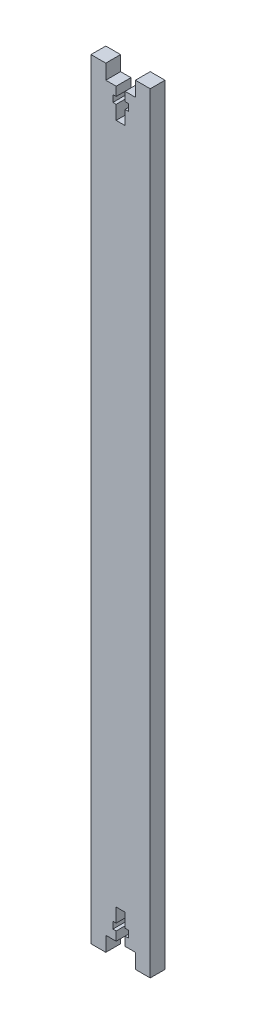
ISO-10303-21;
HEADER;
FILE_DESCRIPTION(('STEP AP214'),'2;1');
FILE_NAME('part.step','',(''),(''),'','','');
FILE_SCHEMA(('AUTOMOTIVE_DESIGN { 1 0 10303 214 1 1 1 1 }'));
ENDSEC;
DATA;
#1=APPLICATION_CONTEXT('core data for automotive mechanical design processes');
#2=APPLICATION_PROTOCOL_DEFINITION('international standard','automotive_design',2000,#1);
#3=PRODUCT_CONTEXT('',#1,'mechanical');
#4=PRODUCT('Part','Part','',(#3));
#5=PRODUCT_RELATED_PRODUCT_CATEGORY('part','',(#4));
#6=PRODUCT_DEFINITION_FORMATION('','',#4);
#7=PRODUCT_DEFINITION_CONTEXT('part definition',#1,'design');
#8=PRODUCT_DEFINITION('design','',#6,#7);
#9=PRODUCT_DEFINITION_SHAPE('','',#8);
#10=(LENGTH_UNIT() NAMED_UNIT(*) SI_UNIT(.MILLI.,.METRE.));
#11=(NAMED_UNIT(*) PLANE_ANGLE_UNIT() SI_UNIT($,.RADIAN.));
#12=(NAMED_UNIT(*) SI_UNIT($,.STERADIAN.) SOLID_ANGLE_UNIT());
#13=UNCERTAINTY_MEASURE_WITH_UNIT(LENGTH_MEASURE(1.E-05),#10,'distance_accuracy_value','');
#14=(GEOMETRIC_REPRESENTATION_CONTEXT(3) GLOBAL_UNCERTAINTY_ASSIGNED_CONTEXT((#13)) GLOBAL_UNIT_ASSIGNED_CONTEXT((#10,
#11,#12)) REPRESENTATION_CONTEXT('',''));
#15=CARTESIAN_POINT('',(0.,0.,0.));
#16=DIRECTION('',(0.,0.,1.));
#17=DIRECTION('',(1.,0.,0.));
#18=AXIS2_PLACEMENT_3D('',#15,#16,#17);
#19=CARTESIAN_POINT('',(-15.1018676210207,4.00000000000001,5.));
#20=DIRECTION('',(0.,1.,0.));
#21=DIRECTION('',(0.,0.,1.));
#22=AXIS2_PLACEMENT_3D('',#19,#20,#21);
#23=PLANE('',#22);
#24=DIRECTION('',(1.,0.,0.));
#25=VECTOR('',#24,1.);
#26=CARTESIAN_POINT('',(-15.1018676210207,4.00000000000001,0.));
#27=LINE('',#26,#25);
#28=CARTESIAN_POINT('',(-20.1018676210207,4.00000000000001,0.));
#29=VERTEX_POINT('',#28);
#30=CARTESIAN_POINT('',(-15.1018676210207,4.00000000000001,0.));
#31=VERTEX_POINT('',#30);
#32=EDGE_CURVE('E296',#29,#31,#27,.T.);
#33=ORIENTED_EDGE('',*,*,#32,.T.);
#34=DIRECTION('',(0.,0.,-1.));
#35=VECTOR('',#34,1.);
#36=CARTESIAN_POINT('',(-15.1018676210207,4.00000000000001,5.));
#37=LINE('',#36,#35);
#38=CARTESIAN_POINT('',(-15.1018676210207,4.00000000000001,5.));
#39=VERTEX_POINT('',#38);
#40=EDGE_CURVE('E40',#39,#31,#37,.T.);
#41=ORIENTED_EDGE('',*,*,#40,.F.);
#42=DIRECTION('',(1.,0.,0.));
#43=VECTOR('',#42,1.);
#44=CARTESIAN_POINT('',(-15.1018676210207,4.00000000000001,5.));
#45=LINE('',#44,#43);
#46=CARTESIAN_POINT('',(-20.1018676210207,4.00000000000001,5.));
#47=VERTEX_POINT('',#46);
#48=EDGE_CURVE('E554',#47,#39,#45,.T.);
#49=ORIENTED_EDGE('',*,*,#48,.F.);
#50=DIRECTION('',(0.,0.,-1.));
#51=VECTOR('',#50,1.);
#52=CARTESIAN_POINT('',(-20.1018676210207,4.00000000000001,5.));
#53=LINE('',#52,#51);
#54=EDGE_CURVE('E11',#47,#29,#53,.T.);
#55=ORIENTED_EDGE('',*,*,#54,.T.);
#56=EDGE_LOOP('',(#33,#41,#49,#55));
#57=FACE_BOUND('',#56,.T.);
#58=ADVANCED_FACE('F32',(#57),#23,.F.);
#59=CARTESIAN_POINT('',(-15.1018676210207,4.00000000000001,5.));
#60=DIRECTION('',(-1.,0.,0.));
#61=DIRECTION('',(0.,0.,1.));
#62=AXIS2_PLACEMENT_3D('',#59,#60,#61);
#63=PLANE('',#62);
#64=DIRECTION('',(0.,1.,0.));
#65=VECTOR('',#64,1.);
#66=CARTESIAN_POINT('',(-15.1018676210207,4.00000000000001,0.));
#67=LINE('',#66,#65);
#68=CARTESIAN_POINT('',(-15.1018676210207,9.00000000000001,0.));
#69=VERTEX_POINT('',#68);
#70=EDGE_CURVE('E298',#31,#69,#67,.T.);
#71=ORIENTED_EDGE('',*,*,#70,.T.);
#72=DIRECTION('',(0.,0.,-1.));
#73=VECTOR('',#72,1.);
#74=CARTESIAN_POINT('',(-15.1018676210207,9.00000000000001,5.));
#75=LINE('',#74,#73);
#76=CARTESIAN_POINT('',(-15.1018676210207,9.00000000000001,5.));
#77=VERTEX_POINT('',#76);
#78=EDGE_CURVE('E456',#77,#69,#75,.T.);
#79=ORIENTED_EDGE('',*,*,#78,.F.);
#80=DIRECTION('',(0.,1.,0.));
#81=VECTOR('',#80,1.);
#82=CARTESIAN_POINT('',(-15.1018676210207,4.00000000000001,5.));
#83=LINE('',#82,#81);
#84=EDGE_CURVE('E465',#39,#77,#83,.T.);
#85=ORIENTED_EDGE('',*,*,#84,.F.);
#86=ORIENTED_EDGE('',*,*,#40,.T.);
#87=EDGE_LOOP('',(#71,#79,#85,#86));
#88=FACE_BOUND('',#87,.T.);
#89=ADVANCED_FACE('F463',(#88),#63,.F.);
#90=CARTESIAN_POINT('',(-11.6018676210207,9.00000000000001,5.));
#91=DIRECTION('',(0.,1.,0.));
#92=DIRECTION('',(0.,0.,1.));
#93=AXIS2_PLACEMENT_3D('',#90,#91,#92);
#94=PLANE('',#93);
#95=DIRECTION('',(1.,0.,0.));
#96=VECTOR('',#95,1.);
#97=CARTESIAN_POINT('',(-11.6018676210207,9.00000000000001,0.));
#98=LINE('',#97,#96);
#99=CARTESIAN_POINT('',(-11.6018676210207,9.00000000000001,0.));
#100=VERTEX_POINT('',#99);
#101=EDGE_CURVE('E300',#69,#100,#98,.T.);
#102=ORIENTED_EDGE('',*,*,#101,.T.);
#103=DIRECTION('',(0.,0.,-1.));
#104=VECTOR('',#103,1.);
#105=CARTESIAN_POINT('',(-11.6018676210207,9.00000000000001,5.));
#106=LINE('',#105,#104);
#107=CARTESIAN_POINT('',(-11.6018676210207,9.00000000000001,5.));
#108=VERTEX_POINT('',#107);
#109=EDGE_CURVE('E453',#108,#100,#106,.T.);
#110=ORIENTED_EDGE('',*,*,#109,.F.);
#111=DIRECTION('',(1.,0.,0.));
#112=VECTOR('',#111,1.);
#113=CARTESIAN_POINT('',(-11.6018676210207,9.00000000000001,5.));
#114=LINE('',#113,#112);
#115=EDGE_CURVE('E486',#77,#108,#114,.T.);
#116=ORIENTED_EDGE('',*,*,#115,.F.);
#117=ORIENTED_EDGE('',*,*,#78,.T.);
#118=EDGE_LOOP('',(#102,#110,#116,#117));
#119=FACE_BOUND('',#118,.T.);
#120=ADVANCED_FACE('F477',(#119),#94,.F.);
#121=CARTESIAN_POINT('',(-11.6018676210207,12.,5.));
#122=DIRECTION('',(-1.,0.,0.));
#123=DIRECTION('',(0.,0.,1.));
#124=AXIS2_PLACEMENT_3D('',#121,#122,#123);
#125=PLANE('',#124);
#126=DIRECTION('',(0.,1.,0.));
#127=VECTOR('',#126,1.);
#128=CARTESIAN_POINT('',(-11.6018676210207,12.,0.));
#129=LINE('',#128,#127);
#130=CARTESIAN_POINT('',(-11.6018676210207,12.,0.));
#131=VERTEX_POINT('',#130);
#132=EDGE_CURVE('E302',#100,#131,#129,.T.);
#133=ORIENTED_EDGE('',*,*,#132,.T.);
#134=DIRECTION('',(0.,0.,-1.));
#135=VECTOR('',#134,1.);
#136=CARTESIAN_POINT('',(-11.6018676210207,12.,5.));
#137=LINE('',#136,#135);
#138=CARTESIAN_POINT('',(-11.6018676210207,12.,5.));
#139=VERTEX_POINT('',#138);
#140=EDGE_CURVE('E450',#139,#131,#137,.T.);
#141=ORIENTED_EDGE('',*,*,#140,.F.);
#142=DIRECTION('',(0.,1.,0.));
#143=VECTOR('',#142,1.);
#144=CARTESIAN_POINT('',(-11.6018676210207,12.,5.));
#145=LINE('',#144,#143);
#146=EDGE_CURVE('E483',#108,#139,#145,.T.);
#147=ORIENTED_EDGE('',*,*,#146,.F.);
#148=ORIENTED_EDGE('',*,*,#109,.T.);
#149=EDGE_LOOP('',(#133,#141,#147,#148));
#150=FACE_BOUND('',#149,.T.);
#151=ADVANCED_FACE('F481',(#150),#125,.F.);
#152=CARTESIAN_POINT('',(-11.6018676210207,12.,5.));
#153=DIRECTION('',(0.,-1.,0.));
#154=DIRECTION('',(0.,0.,-1.));
#155=AXIS2_PLACEMENT_3D('',#152,#153,#154);
#156=PLANE('',#155);
#157=DIRECTION('',(-1.,0.,0.));
#158=VECTOR('',#157,1.);
#159=CARTESIAN_POINT('',(-11.6018676210207,12.,0.));
#160=LINE('',#159,#158);
#161=CARTESIAN_POINT('',(-12.7018676210207,12.,0.));
#162=VERTEX_POINT('',#161);
#163=EDGE_CURVE('E304',#131,#162,#160,.T.);
#164=ORIENTED_EDGE('',*,*,#163,.T.);
#165=DIRECTION('',(0.,0.,-1.));
#166=VECTOR('',#165,1.);
#167=CARTESIAN_POINT('',(-12.7018676210207,12.,5.));
#168=LINE('',#167,#166);
#169=CARTESIAN_POINT('',(-12.7018676210207,12.,5.));
#170=VERTEX_POINT('',#169);
#171=EDGE_CURVE('E447',#170,#162,#168,.T.);
#172=ORIENTED_EDGE('',*,*,#171,.F.);
#173=DIRECTION('',(-1.,0.,0.));
#174=VECTOR('',#173,1.);
#175=CARTESIAN_POINT('',(-11.6018676210207,12.,5.));
#176=LINE('',#175,#174);
#177=EDGE_CURVE('E485',#139,#170,#176,.T.);
#178=ORIENTED_EDGE('',*,*,#177,.F.);
#179=ORIENTED_EDGE('',*,*,#140,.T.);
#180=EDGE_LOOP('',(#164,#172,#178,#179));
#181=FACE_BOUND('',#180,.T.);
#182=ADVANCED_FACE('F568',(#181),#156,.F.);
#183=CARTESIAN_POINT('',(-12.7018676210207,12.,5.));
#184=DIRECTION('',(-1.,0.,0.));
#185=DIRECTION('',(0.,0.,1.));
#186=AXIS2_PLACEMENT_3D('',#183,#184,#185);
#187=PLANE('',#186);
#188=DIRECTION('',(0.,1.,0.));
#189=VECTOR('',#188,1.);
#190=CARTESIAN_POINT('',(-12.7018676210207,12.,0.));
#191=LINE('',#190,#189);
#192=CARTESIAN_POINT('',(-12.7018676210207,14.3,0.));
#193=VERTEX_POINT('',#192);
#194=EDGE_CURVE('E306',#162,#193,#191,.T.);
#195=ORIENTED_EDGE('',*,*,#194,.T.);
#196=DIRECTION('',(0.,0.,-1.));
#197=VECTOR('',#196,1.);
#198=CARTESIAN_POINT('',(-12.7018676210207,14.3,5.));
#199=LINE('',#198,#197);
#200=CARTESIAN_POINT('',(-12.7018676210207,14.3,5.));
#201=VERTEX_POINT('',#200);
#202=EDGE_CURVE('E444',#201,#193,#199,.T.);
#203=ORIENTED_EDGE('',*,*,#202,.F.);
#204=DIRECTION('',(0.,1.,0.));
#205=VECTOR('',#204,1.);
#206=CARTESIAN_POINT('',(-12.7018676210207,12.,5.));
#207=LINE('',#206,#205);
#208=EDGE_CURVE('E488',#170,#201,#207,.T.);
#209=ORIENTED_EDGE('',*,*,#208,.F.);
#210=ORIENTED_EDGE('',*,*,#171,.T.);
#211=EDGE_LOOP('',(#195,#203,#209,#210));
#212=FACE_BOUND('',#211,.T.);
#213=ADVANCED_FACE('F571',(#212),#187,.F.);
#214=CARTESIAN_POINT('',(-12.7018676210207,14.3,5.));
#215=DIRECTION('',(0.,1.,0.));
#216=DIRECTION('',(0.,0.,1.));
#217=AXIS2_PLACEMENT_3D('',#214,#215,#216);
#218=PLANE('',#217);
#219=DIRECTION('',(1.,0.,0.));
#220=VECTOR('',#219,1.);
#221=CARTESIAN_POINT('',(-12.7018676210207,14.3,0.));
#222=LINE('',#221,#220);
#223=CARTESIAN_POINT('',(-11.6018676210207,14.3,0.));
#224=VERTEX_POINT('',#223);
#225=EDGE_CURVE('E308',#193,#224,#222,.T.);
#226=ORIENTED_EDGE('',*,*,#225,.T.);
#227=DIRECTION('',(0.,0.,-1.));
#228=VECTOR('',#227,1.);
#229=CARTESIAN_POINT('',(-11.6018676210207,14.3,5.));
#230=LINE('',#229,#228);
#231=CARTESIAN_POINT('',(-11.6018676210207,14.3,5.));
#232=VERTEX_POINT('',#231);
#233=EDGE_CURVE('E441',#232,#224,#230,.T.);
#234=ORIENTED_EDGE('',*,*,#233,.F.);
#235=DIRECTION('',(1.,0.,0.));
#236=VECTOR('',#235,1.);
#237=CARTESIAN_POINT('',(-12.7018676210207,14.3,5.));
#238=LINE('',#237,#236);
#239=EDGE_CURVE('E494',#201,#232,#238,.T.);
#240=ORIENTED_EDGE('',*,*,#239,.F.);
#241=ORIENTED_EDGE('',*,*,#202,.T.);
#242=EDGE_LOOP('',(#226,#234,#240,#241));
#243=FACE_BOUND('',#242,.T.);
#244=ADVANCED_FACE('F575',(#243),#218,.F.);
#245=CARTESIAN_POINT('',(-11.6018676210207,19.,5.));
#246=DIRECTION('',(-1.,0.,0.));
#247=DIRECTION('',(0.,0.,1.));
#248=AXIS2_PLACEMENT_3D('',#245,#246,#247);
#249=PLANE('',#248);
#250=DIRECTION('',(0.,1.,0.));
#251=VECTOR('',#250,1.);
#252=CARTESIAN_POINT('',(-11.6018676210207,19.,0.));
#253=LINE('',#252,#251);
#254=CARTESIAN_POINT('',(-11.6018676210207,19.,0.));
#255=VERTEX_POINT('',#254);
#256=EDGE_CURVE('E310',#224,#255,#253,.T.);
#257=ORIENTED_EDGE('',*,*,#256,.T.);
#258=DIRECTION('',(0.,0.,-1.));
#259=VECTOR('',#258,1.);
#260=CARTESIAN_POINT('',(-11.6018676210207,19.,5.));
#261=LINE('',#260,#259);
#262=CARTESIAN_POINT('',(-11.6018676210207,19.,5.));
#263=VERTEX_POINT('',#262);
#264=EDGE_CURVE('E438',#263,#255,#261,.T.);
#265=ORIENTED_EDGE('',*,*,#264,.F.);
#266=DIRECTION('',(0.,1.,0.));
#267=VECTOR('',#266,1.);
#268=CARTESIAN_POINT('',(-11.6018676210207,19.,5.));
#269=LINE('',#268,#267);
#270=EDGE_CURVE('E496',#232,#263,#269,.T.);
#271=ORIENTED_EDGE('',*,*,#270,.F.);
#272=ORIENTED_EDGE('',*,*,#233,.T.);
#273=EDGE_LOOP('',(#257,#265,#271,#272));
#274=FACE_BOUND('',#273,.T.);
#275=ADVANCED_FACE('F579',(#274),#249,.F.);
#276=CARTESIAN_POINT('',(-8.60186762102071,19.,5.));
#277=DIRECTION('',(0.,1.,0.));
#278=DIRECTION('',(0.,0.,1.));
#279=AXIS2_PLACEMENT_3D('',#276,#277,#278);
#280=PLANE('',#279);
#281=DIRECTION('',(1.,0.,0.));
#282=VECTOR('',#281,1.);
#283=CARTESIAN_POINT('',(-8.60186762102071,19.,0.));
#284=LINE('',#283,#282);
#285=CARTESIAN_POINT('',(-8.60186762102071,19.,0.));
#286=VERTEX_POINT('',#285);
#287=EDGE_CURVE('E312',#255,#286,#284,.T.);
#288=ORIENTED_EDGE('',*,*,#287,.T.);
#289=DIRECTION('',(0.,0.,-1.));
#290=VECTOR('',#289,1.);
#291=CARTESIAN_POINT('',(-8.60186762102071,19.,5.));
#292=LINE('',#291,#290);
#293=CARTESIAN_POINT('',(-8.60186762102071,19.,5.));
#294=VERTEX_POINT('',#293);
#295=EDGE_CURVE('E435',#294,#286,#292,.T.);
#296=ORIENTED_EDGE('',*,*,#295,.F.);
#297=DIRECTION('',(1.,0.,0.));
#298=VECTOR('',#297,1.);
#299=CARTESIAN_POINT('',(-8.60186762102071,19.,5.));
#300=LINE('',#299,#298);
#301=EDGE_CURVE('E498',#263,#294,#300,.T.);
#302=ORIENTED_EDGE('',*,*,#301,.F.);
#303=ORIENTED_EDGE('',*,*,#264,.T.);
#304=EDGE_LOOP('',(#288,#296,#302,#303));
#305=FACE_BOUND('',#304,.T.);
#306=ADVANCED_FACE('F583',(#305),#280,.F.);
#307=CARTESIAN_POINT('',(-8.60186762102071,14.3,5.));
#308=DIRECTION('',(1.,0.,0.));
#309=DIRECTION('',(0.,0.,-1.));
#310=AXIS2_PLACEMENT_3D('',#307,#308,#309);
#311=PLANE('',#310);
#312=DIRECTION('',(0.,-1.,0.));
#313=VECTOR('',#312,1.);
#314=CARTESIAN_POINT('',(-8.60186762102071,14.3,0.));
#315=LINE('',#314,#313);
#316=CARTESIAN_POINT('',(-8.60186762102071,14.3,0.));
#317=VERTEX_POINT('',#316);
#318=EDGE_CURVE('E314',#286,#317,#315,.T.);
#319=ORIENTED_EDGE('',*,*,#318,.T.);
#320=DIRECTION('',(0.,0.,-1.));
#321=VECTOR('',#320,1.);
#322=CARTESIAN_POINT('',(-8.60186762102071,14.3,5.));
#323=LINE('',#322,#321);
#324=CARTESIAN_POINT('',(-8.60186762102071,14.3,5.));
#325=VERTEX_POINT('',#324);
#326=EDGE_CURVE('E432',#325,#317,#323,.T.);
#327=ORIENTED_EDGE('',*,*,#326,.F.);
#328=DIRECTION('',(0.,-1.,0.));
#329=VECTOR('',#328,1.);
#330=CARTESIAN_POINT('',(-8.60186762102071,14.3,5.));
#331=LINE('',#330,#329);
#332=EDGE_CURVE('E500',#294,#325,#331,.T.);
#333=ORIENTED_EDGE('',*,*,#332,.F.);
#334=ORIENTED_EDGE('',*,*,#295,.T.);
#335=EDGE_LOOP('',(#319,#327,#333,#334));
#336=FACE_BOUND('',#335,.T.);
#337=ADVANCED_FACE('F587',(#336),#311,.F.);
#338=CARTESIAN_POINT('',(-8.60186762102071,14.3,5.));
#339=DIRECTION('',(0.,1.,0.));
#340=DIRECTION('',(0.,0.,1.));
#341=AXIS2_PLACEMENT_3D('',#338,#339,#340);
#342=PLANE('',#341);
#343=DIRECTION('',(1.,0.,0.));
#344=VECTOR('',#343,1.);
#345=CARTESIAN_POINT('',(-8.60186762102071,14.3,0.));
#346=LINE('',#345,#344);
#347=CARTESIAN_POINT('',(-7.50186762102071,14.3,0.));
#348=VERTEX_POINT('',#347);
#349=EDGE_CURVE('E316',#317,#348,#346,.T.);
#350=ORIENTED_EDGE('',*,*,#349,.T.);
#351=DIRECTION('',(0.,0.,-1.));
#352=VECTOR('',#351,1.);
#353=CARTESIAN_POINT('',(-7.50186762102071,14.3,5.));
#354=LINE('',#353,#352);
#355=CARTESIAN_POINT('',(-7.50186762102071,14.3,5.));
#356=VERTEX_POINT('',#355);
#357=EDGE_CURVE('E429',#356,#348,#354,.T.);
#358=ORIENTED_EDGE('',*,*,#357,.F.);
#359=DIRECTION('',(1.,0.,0.));
#360=VECTOR('',#359,1.);
#361=CARTESIAN_POINT('',(-8.60186762102071,14.3,5.));
#362=LINE('',#361,#360);
#363=EDGE_CURVE('E502',#325,#356,#362,.T.);
#364=ORIENTED_EDGE('',*,*,#363,.F.);
#365=ORIENTED_EDGE('',*,*,#326,.T.);
#366=EDGE_LOOP('',(#350,#358,#364,#365));
#367=FACE_BOUND('',#366,.T.);
#368=ADVANCED_FACE('F591',(#367),#342,.F.);
#369=CARTESIAN_POINT('',(-7.50186762102071,14.3,5.));
#370=DIRECTION('',(1.,0.,0.));
#371=DIRECTION('',(0.,0.,-1.));
#372=AXIS2_PLACEMENT_3D('',#369,#370,#371);
#373=PLANE('',#372);
#374=DIRECTION('',(0.,-1.,0.));
#375=VECTOR('',#374,1.);
#376=CARTESIAN_POINT('',(-7.50186762102071,14.3,0.));
#377=LINE('',#376,#375);
#378=CARTESIAN_POINT('',(-7.50186762102071,12.,0.));
#379=VERTEX_POINT('',#378);
#380=EDGE_CURVE('E318',#348,#379,#377,.T.);
#381=ORIENTED_EDGE('',*,*,#380,.T.);
#382=DIRECTION('',(0.,0.,-1.));
#383=VECTOR('',#382,1.);
#384=CARTESIAN_POINT('',(-7.50186762102071,12.,5.));
#385=LINE('',#384,#383);
#386=CARTESIAN_POINT('',(-7.50186762102071,12.,5.));
#387=VERTEX_POINT('',#386);
#388=EDGE_CURVE('E426',#387,#379,#385,.T.);
#389=ORIENTED_EDGE('',*,*,#388,.F.);
#390=DIRECTION('',(0.,-1.,0.));
#391=VECTOR('',#390,1.);
#392=CARTESIAN_POINT('',(-7.50186762102071,14.3,5.));
#393=LINE('',#392,#391);
#394=EDGE_CURVE('E504',#356,#387,#393,.T.);
#395=ORIENTED_EDGE('',*,*,#394,.F.);
#396=ORIENTED_EDGE('',*,*,#357,.T.);
#397=EDGE_LOOP('',(#381,#389,#395,#396));
#398=FACE_BOUND('',#397,.T.);
#399=ADVANCED_FACE('F595',(#398),#373,.F.);
#400=CARTESIAN_POINT('',(-7.50186762102071,12.,5.));
#401=DIRECTION('',(0.,-1.,0.));
#402=DIRECTION('',(0.,0.,-1.));
#403=AXIS2_PLACEMENT_3D('',#400,#401,#402);
#404=PLANE('',#403);
#405=DIRECTION('',(-1.,0.,0.));
#406=VECTOR('',#405,1.);
#407=CARTESIAN_POINT('',(-7.50186762102071,12.,0.));
#408=LINE('',#407,#406);
#409=CARTESIAN_POINT('',(-8.60186762102071,12.,0.));
#410=VERTEX_POINT('',#409);
#411=EDGE_CURVE('E320',#379,#410,#408,.T.);
#412=ORIENTED_EDGE('',*,*,#411,.T.);
#413=DIRECTION('',(0.,0.,-1.));
#414=VECTOR('',#413,1.);
#415=CARTESIAN_POINT('',(-8.60186762102071,12.,5.));
#416=LINE('',#415,#414);
#417=CARTESIAN_POINT('',(-8.60186762102071,12.,5.));
#418=VERTEX_POINT('',#417);
#419=EDGE_CURVE('E423',#418,#410,#416,.T.);
#420=ORIENTED_EDGE('',*,*,#419,.F.);
#421=DIRECTION('',(-1.,0.,0.));
#422=VECTOR('',#421,1.);
#423=CARTESIAN_POINT('',(-7.50186762102071,12.,5.));
#424=LINE('',#423,#422);
#425=EDGE_CURVE('E506',#387,#418,#424,.T.);
#426=ORIENTED_EDGE('',*,*,#425,.F.);
#427=ORIENTED_EDGE('',*,*,#388,.T.);
#428=EDGE_LOOP('',(#412,#420,#426,#427));
#429=FACE_BOUND('',#428,.T.);
#430=ADVANCED_FACE('F599',(#429),#404,.F.);
#431=CARTESIAN_POINT('',(-8.60186762102071,9.00000000000001,5.));
#432=DIRECTION('',(1.,0.,0.));
#433=DIRECTION('',(0.,0.,-1.));
#434=AXIS2_PLACEMENT_3D('',#431,#432,#433);
#435=PLANE('',#434);
#436=DIRECTION('',(0.,-1.,0.));
#437=VECTOR('',#436,1.);
#438=CARTESIAN_POINT('',(-8.60186762102071,9.00000000000001,0.));
#439=LINE('',#438,#437);
#440=CARTESIAN_POINT('',(-8.60186762102071,9.00000000000001,0.));
#441=VERTEX_POINT('',#440);
#442=EDGE_CURVE('E322',#410,#441,#439,.T.);
#443=ORIENTED_EDGE('',*,*,#442,.T.);
#444=DIRECTION('',(0.,0.,-1.));
#445=VECTOR('',#444,1.);
#446=CARTESIAN_POINT('',(-8.60186762102071,9.00000000000001,5.));
#447=LINE('',#446,#445);
#448=CARTESIAN_POINT('',(-8.60186762102071,9.00000000000001,5.));
#449=VERTEX_POINT('',#448);
#450=EDGE_CURVE('E420',#449,#441,#447,.T.);
#451=ORIENTED_EDGE('',*,*,#450,.F.);
#452=DIRECTION('',(0.,-1.,0.));
#453=VECTOR('',#452,1.);
#454=CARTESIAN_POINT('',(-8.60186762102071,9.00000000000001,5.));
#455=LINE('',#454,#453);
#456=EDGE_CURVE('E508',#418,#449,#455,.T.);
#457=ORIENTED_EDGE('',*,*,#456,.F.);
#458=ORIENTED_EDGE('',*,*,#419,.T.);
#459=EDGE_LOOP('',(#443,#451,#457,#458));
#460=FACE_BOUND('',#459,.T.);
#461=ADVANCED_FACE('F603',(#460),#435,.F.);
#462=CARTESIAN_POINT('',(-8.60186762102071,9.00000000000001,5.));
#463=DIRECTION('',(0.,1.,0.));
#464=DIRECTION('',(0.,0.,1.));
#465=AXIS2_PLACEMENT_3D('',#462,#463,#464);
#466=PLANE('',#465);
#467=DIRECTION('',(1.,0.,0.));
#468=VECTOR('',#467,1.);
#469=CARTESIAN_POINT('',(-8.60186762102071,9.00000000000001,0.));
#470=LINE('',#469,#468);
#471=CARTESIAN_POINT('',(-5.10186762102071,9.00000000000001,0.));
#472=VERTEX_POINT('',#471);
#473=EDGE_CURVE('E324',#441,#472,#470,.T.);
#474=ORIENTED_EDGE('',*,*,#473,.T.);
#475=DIRECTION('',(0.,0.,-1.));
#476=VECTOR('',#475,1.);
#477=CARTESIAN_POINT('',(-5.10186762102071,9.00000000000001,5.));
#478=LINE('',#477,#476);
#479=CARTESIAN_POINT('',(-5.10186762102071,9.00000000000001,5.));
#480=VERTEX_POINT('',#479);
#481=EDGE_CURVE('E417',#480,#472,#478,.T.);
#482=ORIENTED_EDGE('',*,*,#481,.F.);
#483=DIRECTION('',(1.,0.,0.));
#484=VECTOR('',#483,1.);
#485=CARTESIAN_POINT('',(-8.60186762102071,9.00000000000001,5.));
#486=LINE('',#485,#484);
#487=EDGE_CURVE('E510',#449,#480,#486,.T.);
#488=ORIENTED_EDGE('',*,*,#487,.F.);
#489=ORIENTED_EDGE('',*,*,#450,.T.);
#490=EDGE_LOOP('',(#474,#482,#488,#489));
#491=FACE_BOUND('',#490,.T.);
#492=ADVANCED_FACE('F607',(#491),#466,.F.);
#493=CARTESIAN_POINT('',(-5.10186762102071,9.00000000000001,5.));
#494=DIRECTION('',(1.,0.,0.));
#495=DIRECTION('',(0.,0.,-1.));
#496=AXIS2_PLACEMENT_3D('',#493,#494,#495);
#497=PLANE('',#496);
#498=DIRECTION('',(0.,-1.,0.));
#499=VECTOR('',#498,1.);
#500=CARTESIAN_POINT('',(-5.10186762102071,9.00000000000001,0.));
#501=LINE('',#500,#499);
#502=CARTESIAN_POINT('',(-5.10186762102071,4.00000000000001,0.));
#503=VERTEX_POINT('',#502);
#504=EDGE_CURVE('E326',#472,#503,#501,.T.);
#505=ORIENTED_EDGE('',*,*,#504,.T.);
#506=DIRECTION('',(0.,0.,-1.));
#507=VECTOR('',#506,1.);
#508=CARTESIAN_POINT('',(-5.10186762102071,4.00000000000001,5.));
#509=LINE('',#508,#507);
#510=CARTESIAN_POINT('',(-5.10186762102071,4.00000000000001,5.));
#511=VERTEX_POINT('',#510);
#512=EDGE_CURVE('E414',#511,#503,#509,.T.);
#513=ORIENTED_EDGE('',*,*,#512,.F.);
#514=DIRECTION('',(0.,-1.,0.));
#515=VECTOR('',#514,1.);
#516=CARTESIAN_POINT('',(-5.10186762102071,9.00000000000001,5.));
#517=LINE('',#516,#515);
#518=EDGE_CURVE('E512',#480,#511,#517,.T.);
#519=ORIENTED_EDGE('',*,*,#518,.F.);
#520=ORIENTED_EDGE('',*,*,#481,.T.);
#521=EDGE_LOOP('',(#505,#513,#519,#520));
#522=FACE_BOUND('',#521,.T.);
#523=ADVANCED_FACE('F611',(#522),#497,.F.);
#524=CARTESIAN_POINT('',(-5.10186762102071,4.00000000000001,5.));
#525=DIRECTION('',(0.,1.,0.));
#526=DIRECTION('',(0.,0.,1.));
#527=AXIS2_PLACEMENT_3D('',#524,#525,#526);
#528=PLANE('',#527);
#529=DIRECTION('',(1.,0.,0.));
#530=VECTOR('',#529,1.);
#531=CARTESIAN_POINT('',(-5.10186762102071,4.00000000000001,0.));
#532=LINE('',#531,#530);
#533=CARTESIAN_POINT('',(-0.101867621020709,4.00000000000001,0.));
#534=VERTEX_POINT('',#533);
#535=EDGE_CURVE('E328',#503,#534,#532,.T.);
#536=ORIENTED_EDGE('',*,*,#535,.T.);
#537=DIRECTION('',(0.,0.,-1.));
#538=VECTOR('',#537,1.);
#539=CARTESIAN_POINT('',(-0.101867621020709,4.00000000000001,5.));
#540=LINE('',#539,#538);
#541=CARTESIAN_POINT('',(-0.101867621020709,4.00000000000001,5.));
#542=VERTEX_POINT('',#541);
#543=EDGE_CURVE('E411',#542,#534,#540,.T.);
#544=ORIENTED_EDGE('',*,*,#543,.F.);
#545=DIRECTION('',(1.,0.,0.));
#546=VECTOR('',#545,1.);
#547=CARTESIAN_POINT('',(-5.10186762102071,4.00000000000001,5.));
#548=LINE('',#547,#546);
#549=EDGE_CURVE('E514',#511,#542,#548,.T.);
#550=ORIENTED_EDGE('',*,*,#549,.F.);
#551=ORIENTED_EDGE('',*,*,#512,.T.);
#552=EDGE_LOOP('',(#536,#544,#550,#551));
#553=FACE_BOUND('',#552,.T.);
#554=ADVANCED_FACE('F615',(#553),#528,.F.);
#555=CARTESIAN_POINT('',(-0.101867621020714,264.,5.));
#556=DIRECTION('',(-1.,0.,0.));
#557=DIRECTION('',(0.,-1.,0.));
#558=AXIS2_PLACEMENT_3D('',#555,#556,#557);
#559=PLANE('',#558);
#560=DIRECTION('',(0.,1.,0.));
#561=VECTOR('',#560,1.);
#562=CARTESIAN_POINT('',(-0.101867621020714,264.,0.));
#563=LINE('',#562,#561);
#564=CARTESIAN_POINT('',(-0.101867621020714,264.,0.));
#565=VERTEX_POINT('',#564);
#566=EDGE_CURVE('E331',#534,#565,#563,.T.);
#567=ORIENTED_EDGE('',*,*,#566,.T.);
#568=DIRECTION('',(0.,0.,-1.));
#569=VECTOR('',#568,1.);
#570=CARTESIAN_POINT('',(-0.101867621020714,264.,5.));
#571=LINE('',#570,#569);
#572=CARTESIAN_POINT('',(-0.101867621020714,264.,5.));
#573=VERTEX_POINT('',#572);
#574=EDGE_CURVE('E408',#573,#565,#571,.T.);
#575=ORIENTED_EDGE('',*,*,#574,.F.);
#576=DIRECTION('',(0.,1.,0.));
#577=VECTOR('',#576,1.);
#578=CARTESIAN_POINT('',(-0.101867621020709,4.00000000000001,5.));
#579=LINE('',#578,#577);
#580=EDGE_CURVE('E516',#542,#573,#579,.T.);
#581=ORIENTED_EDGE('',*,*,#580,.F.);
#582=ORIENTED_EDGE('',*,*,#543,.T.);
#583=EDGE_LOOP('',(#567,#575,#581,#582));
#584=FACE_BOUND('',#583,.T.);
#585=ADVANCED_FACE('F619',(#584),#559,.F.);
#586=CARTESIAN_POINT('',(-5.10186762102072,264.,5.));
#587=DIRECTION('',(0.,-1.,0.));
#588=DIRECTION('',(0.,0.,-1.));
#589=AXIS2_PLACEMENT_3D('',#586,#587,#588);
#590=PLANE('',#589);
#591=DIRECTION('',(-1.,0.,0.));
#592=VECTOR('',#591,1.);
#593=CARTESIAN_POINT('',(-5.10186762102072,264.,0.));
#594=LINE('',#593,#592);
#595=CARTESIAN_POINT('',(-5.10186762102072,264.,0.));
#596=VERTEX_POINT('',#595);
#597=EDGE_CURVE('E333',#565,#596,#594,.T.);
#598=ORIENTED_EDGE('',*,*,#597,.T.);
#599=DIRECTION('',(0.,0.,-1.));
#600=VECTOR('',#599,1.);
#601=CARTESIAN_POINT('',(-5.10186762102072,264.,5.));
#602=LINE('',#601,#600);
#603=CARTESIAN_POINT('',(-5.10186762102072,264.,5.));
#604=VERTEX_POINT('',#603);
#605=EDGE_CURVE('E405',#604,#596,#602,.T.);
#606=ORIENTED_EDGE('',*,*,#605,.F.);
#607=DIRECTION('',(-1.,0.,0.));
#608=VECTOR('',#607,1.);
#609=CARTESIAN_POINT('',(-5.10186762102072,264.,5.));
#610=LINE('',#609,#608);
#611=EDGE_CURVE('E518',#573,#604,#610,.T.);
#612=ORIENTED_EDGE('',*,*,#611,.F.);
#613=ORIENTED_EDGE('',*,*,#574,.T.);
#614=EDGE_LOOP('',(#598,#606,#612,#613));
#615=FACE_BOUND('',#614,.T.);
#616=ADVANCED_FACE('F623',(#615),#590,.F.);
#617=CARTESIAN_POINT('',(-5.10186762102072,264.,5.));
#618=DIRECTION('',(1.,0.,0.));
#619=DIRECTION('',(0.,1.,0.));
#620=AXIS2_PLACEMENT_3D('',#617,#618,#619);
#621=PLANE('',#620);
#622=DIRECTION('',(0.,-1.,0.));
#623=VECTOR('',#622,1.);
#624=CARTESIAN_POINT('',(-5.10186762102072,264.,0.));
#625=LINE('',#624,#623);
#626=CARTESIAN_POINT('',(-5.10186762102071,259.,0.));
#627=VERTEX_POINT('',#626);
#628=EDGE_CURVE('E335',#596,#627,#625,.T.);
#629=ORIENTED_EDGE('',*,*,#628,.T.);
#630=DIRECTION('',(0.,0.,-1.));
#631=VECTOR('',#630,1.);
#632=CARTESIAN_POINT('',(-5.10186762102071,259.,5.));
#633=LINE('',#632,#631);
#634=CARTESIAN_POINT('',(-5.10186762102071,259.,5.));
#635=VERTEX_POINT('',#634);
#636=EDGE_CURVE('E402',#635,#627,#633,.T.);
#637=ORIENTED_EDGE('',*,*,#636,.F.);
#638=DIRECTION('',(0.,-1.,0.));
#639=VECTOR('',#638,1.);
#640=CARTESIAN_POINT('',(-5.10186762102072,264.,5.));
#641=LINE('',#640,#639);
#642=EDGE_CURVE('E520',#604,#635,#641,.T.);
#643=ORIENTED_EDGE('',*,*,#642,.F.);
#644=ORIENTED_EDGE('',*,*,#605,.T.);
#645=EDGE_LOOP('',(#629,#637,#643,#644));
#646=FACE_BOUND('',#645,.T.);
#647=ADVANCED_FACE('F627',(#646),#621,.F.);
#648=CARTESIAN_POINT('',(-8.60186762102071,259.,5.));
#649=DIRECTION('',(0.,-1.,0.));
#650=DIRECTION('',(0.,0.,-1.));
#651=AXIS2_PLACEMENT_3D('',#648,#649,#650);
#652=PLANE('',#651);
#653=DIRECTION('',(-1.,0.,0.));
#654=VECTOR('',#653,1.);
#655=CARTESIAN_POINT('',(-8.60186762102071,259.,0.));
#656=LINE('',#655,#654);
#657=CARTESIAN_POINT('',(-8.60186762102071,259.,0.));
#658=VERTEX_POINT('',#657);
#659=EDGE_CURVE('E337',#627,#658,#656,.T.);
#660=ORIENTED_EDGE('',*,*,#659,.T.);
#661=DIRECTION('',(0.,0.,-1.));
#662=VECTOR('',#661,1.);
#663=CARTESIAN_POINT('',(-8.60186762102071,259.,5.));
#664=LINE('',#663,#662);
#665=CARTESIAN_POINT('',(-8.60186762102071,259.,5.));
#666=VERTEX_POINT('',#665);
#667=EDGE_CURVE('E399',#666,#658,#664,.T.);
#668=ORIENTED_EDGE('',*,*,#667,.F.);
#669=DIRECTION('',(-1.,0.,0.));
#670=VECTOR('',#669,1.);
#671=CARTESIAN_POINT('',(-8.60186762102071,259.,5.));
#672=LINE('',#671,#670);
#673=EDGE_CURVE('E522',#635,#666,#672,.T.);
#674=ORIENTED_EDGE('',*,*,#673,.F.);
#675=ORIENTED_EDGE('',*,*,#636,.T.);
#676=EDGE_LOOP('',(#660,#668,#674,#675));
#677=FACE_BOUND('',#676,.T.);
#678=ADVANCED_FACE('F631',(#677),#652,.F.);
#679=CARTESIAN_POINT('',(-8.60186762102071,256.,5.));
#680=DIRECTION('',(1.,0.,0.));
#681=DIRECTION('',(0.,0.,-1.));
#682=AXIS2_PLACEMENT_3D('',#679,#680,#681);
#683=PLANE('',#682);
#684=DIRECTION('',(0.,-1.,0.));
#685=VECTOR('',#684,1.);
#686=CARTESIAN_POINT('',(-8.60186762102071,256.,0.));
#687=LINE('',#686,#685);
#688=CARTESIAN_POINT('',(-8.60186762102071,256.,0.));
#689=VERTEX_POINT('',#688);
#690=EDGE_CURVE('E339',#658,#689,#687,.T.);
#691=ORIENTED_EDGE('',*,*,#690,.T.);
#692=DIRECTION('',(0.,0.,-1.));
#693=VECTOR('',#692,1.);
#694=CARTESIAN_POINT('',(-8.60186762102071,256.,5.));
#695=LINE('',#694,#693);
#696=CARTESIAN_POINT('',(-8.60186762102071,256.,5.));
#697=VERTEX_POINT('',#696);
#698=EDGE_CURVE('E396',#697,#689,#695,.T.);
#699=ORIENTED_EDGE('',*,*,#698,.F.);
#700=DIRECTION('',(0.,-1.,0.));
#701=VECTOR('',#700,1.);
#702=CARTESIAN_POINT('',(-8.60186762102071,256.,5.));
#703=LINE('',#702,#701);
#704=EDGE_CURVE('E524',#666,#697,#703,.T.);
#705=ORIENTED_EDGE('',*,*,#704,.F.);
#706=ORIENTED_EDGE('',*,*,#667,.T.);
#707=EDGE_LOOP('',(#691,#699,#705,#706));
#708=FACE_BOUND('',#707,.T.);
#709=ADVANCED_FACE('F635',(#708),#683,.F.);
#710=CARTESIAN_POINT('',(-8.60186762102071,256.,5.));
#711=DIRECTION('',(0.,1.,0.));
#712=DIRECTION('',(0.,0.,1.));
#713=AXIS2_PLACEMENT_3D('',#710,#711,#712);
#714=PLANE('',#713);
#715=DIRECTION('',(1.,0.,0.));
#716=VECTOR('',#715,1.);
#717=CARTESIAN_POINT('',(-8.60186762102071,256.,0.));
#718=LINE('',#717,#716);
#719=CARTESIAN_POINT('',(-7.50186762102075,256.,0.));
#720=VERTEX_POINT('',#719);
#721=EDGE_CURVE('E341',#689,#720,#718,.T.);
#722=ORIENTED_EDGE('',*,*,#721,.T.);
#723=DIRECTION('',(0.,0.,-1.));
#724=VECTOR('',#723,1.);
#725=CARTESIAN_POINT('',(-7.50186762102075,256.,5.));
#726=LINE('',#725,#724);
#727=CARTESIAN_POINT('',(-7.50186762102075,256.,5.));
#728=VERTEX_POINT('',#727);
#729=EDGE_CURVE('E393',#728,#720,#726,.T.);
#730=ORIENTED_EDGE('',*,*,#729,.F.);
#731=DIRECTION('',(1.,0.,0.));
#732=VECTOR('',#731,1.);
#733=CARTESIAN_POINT('',(-8.60186762102071,256.,5.));
#734=LINE('',#733,#732);
#735=EDGE_CURVE('E526',#697,#728,#734,.T.);
#736=ORIENTED_EDGE('',*,*,#735,.F.);
#737=ORIENTED_EDGE('',*,*,#698,.T.);
#738=EDGE_LOOP('',(#722,#730,#736,#737));
#739=FACE_BOUND('',#738,.T.);
#740=ADVANCED_FACE('F639',(#739),#714,.F.);
#741=CARTESIAN_POINT('',(-7.50186762102075,256.,5.));
#742=DIRECTION('',(1.,0.,0.));
#743=DIRECTION('',(0.,1.,0.));
#744=AXIS2_PLACEMENT_3D('',#741,#742,#743);
#745=PLANE('',#744);
#746=DIRECTION('',(0.,-1.,0.));
#747=VECTOR('',#746,1.);
#748=CARTESIAN_POINT('',(-7.50186762102075,256.,0.));
#749=LINE('',#748,#747);
#750=CARTESIAN_POINT('',(-7.50186762102075,253.7,0.));
#751=VERTEX_POINT('',#750);
#752=EDGE_CURVE('E343',#720,#751,#749,.T.);
#753=ORIENTED_EDGE('',*,*,#752,.T.);
#754=DIRECTION('',(0.,0.,-1.));
#755=VECTOR('',#754,1.);
#756=CARTESIAN_POINT('',(-7.50186762102075,253.7,5.));
#757=LINE('',#756,#755);
#758=CARTESIAN_POINT('',(-7.50186762102075,253.7,5.));
#759=VERTEX_POINT('',#758);
#760=EDGE_CURVE('E390',#759,#751,#757,.T.);
#761=ORIENTED_EDGE('',*,*,#760,.F.);
#762=DIRECTION('',(0.,-1.,0.));
#763=VECTOR('',#762,1.);
#764=CARTESIAN_POINT('',(-7.50186762102075,256.,5.));
#765=LINE('',#764,#763);
#766=EDGE_CURVE('E528',#728,#759,#765,.T.);
#767=ORIENTED_EDGE('',*,*,#766,.F.);
#768=ORIENTED_EDGE('',*,*,#729,.T.);
#769=EDGE_LOOP('',(#753,#761,#767,#768));
#770=FACE_BOUND('',#769,.T.);
#771=ADVANCED_FACE('F643',(#770),#745,.F.);
#772=CARTESIAN_POINT('',(-7.50186762102075,253.7,5.));
#773=DIRECTION('',(0.,-1.,0.));
#774=DIRECTION('',(0.,0.,-1.));
#775=AXIS2_PLACEMENT_3D('',#772,#773,#774);
#776=PLANE('',#775);
#777=DIRECTION('',(-1.,0.,0.));
#778=VECTOR('',#777,1.);
#779=CARTESIAN_POINT('',(-7.50186762102075,253.7,0.));
#780=LINE('',#779,#778);
#781=CARTESIAN_POINT('',(-8.60186762102071,253.7,0.));
#782=VERTEX_POINT('',#781);
#783=EDGE_CURVE('E345',#751,#782,#780,.T.);
#784=ORIENTED_EDGE('',*,*,#783,.T.);
#785=DIRECTION('',(0.,0.,-1.));
#786=VECTOR('',#785,1.);
#787=CARTESIAN_POINT('',(-8.60186762102071,253.7,5.));
#788=LINE('',#787,#786);
#789=CARTESIAN_POINT('',(-8.60186762102071,253.7,5.));
#790=VERTEX_POINT('',#789);
#791=EDGE_CURVE('E387',#790,#782,#788,.T.);
#792=ORIENTED_EDGE('',*,*,#791,.F.);
#793=DIRECTION('',(-1.,0.,0.));
#794=VECTOR('',#793,1.);
#795=CARTESIAN_POINT('',(-7.50186762102075,253.7,5.));
#796=LINE('',#795,#794);
#797=EDGE_CURVE('E530',#759,#790,#796,.T.);
#798=ORIENTED_EDGE('',*,*,#797,.F.);
#799=ORIENTED_EDGE('',*,*,#760,.T.);
#800=EDGE_LOOP('',(#784,#792,#798,#799));
#801=FACE_BOUND('',#800,.T.);
#802=ADVANCED_FACE('F647',(#801),#776,.F.);
#803=CARTESIAN_POINT('',(-8.60186762102071,249.,5.));
#804=DIRECTION('',(1.,0.,0.));
#805=DIRECTION('',(0.,1.,0.));
#806=AXIS2_PLACEMENT_3D('',#803,#804,#805);
#807=PLANE('',#806);
#808=DIRECTION('',(0.,-1.,0.));
#809=VECTOR('',#808,1.);
#810=CARTESIAN_POINT('',(-8.60186762102071,249.,0.));
#811=LINE('',#810,#809);
#812=CARTESIAN_POINT('',(-8.60186762102071,249.,0.));
#813=VERTEX_POINT('',#812);
#814=EDGE_CURVE('E347',#782,#813,#811,.T.);
#815=ORIENTED_EDGE('',*,*,#814,.T.);
#816=DIRECTION('',(0.,0.,-1.));
#817=VECTOR('',#816,1.);
#818=CARTESIAN_POINT('',(-8.60186762102071,249.,5.));
#819=LINE('',#818,#817);
#820=CARTESIAN_POINT('',(-8.60186762102071,249.,5.));
#821=VERTEX_POINT('',#820);
#822=EDGE_CURVE('E384',#821,#813,#819,.T.);
#823=ORIENTED_EDGE('',*,*,#822,.F.);
#824=DIRECTION('',(0.,-1.,0.));
#825=VECTOR('',#824,1.);
#826=CARTESIAN_POINT('',(-8.60186762102071,249.,5.));
#827=LINE('',#826,#825);
#828=EDGE_CURVE('E532',#790,#821,#827,.T.);
#829=ORIENTED_EDGE('',*,*,#828,.F.);
#830=ORIENTED_EDGE('',*,*,#791,.T.);
#831=EDGE_LOOP('',(#815,#823,#829,#830));
#832=FACE_BOUND('',#831,.T.);
#833=ADVANCED_FACE('F651',(#832),#807,.F.);
#834=CARTESIAN_POINT('',(-11.6018676210207,249.,5.));
#835=DIRECTION('',(0.,-1.,0.));
#836=DIRECTION('',(0.,0.,-1.));
#837=AXIS2_PLACEMENT_3D('',#834,#835,#836);
#838=PLANE('',#837);
#839=DIRECTION('',(-1.,0.,0.));
#840=VECTOR('',#839,1.);
#841=CARTESIAN_POINT('',(-11.6018676210207,249.,0.));
#842=LINE('',#841,#840);
#843=CARTESIAN_POINT('',(-11.6018676210207,249.,0.));
#844=VERTEX_POINT('',#843);
#845=EDGE_CURVE('E349',#813,#844,#842,.T.);
#846=ORIENTED_EDGE('',*,*,#845,.T.);
#847=DIRECTION('',(0.,0.,-1.));
#848=VECTOR('',#847,1.);
#849=CARTESIAN_POINT('',(-11.6018676210207,249.,5.));
#850=LINE('',#849,#848);
#851=CARTESIAN_POINT('',(-11.6018676210207,249.,5.));
#852=VERTEX_POINT('',#851);
#853=EDGE_CURVE('E381',#852,#844,#850,.T.);
#854=ORIENTED_EDGE('',*,*,#853,.F.);
#855=DIRECTION('',(-1.,0.,0.));
#856=VECTOR('',#855,1.);
#857=CARTESIAN_POINT('',(-11.6018676210207,249.,5.));
#858=LINE('',#857,#856);
#859=EDGE_CURVE('E534',#821,#852,#858,.T.);
#860=ORIENTED_EDGE('',*,*,#859,.F.);
#861=ORIENTED_EDGE('',*,*,#822,.T.);
#862=EDGE_LOOP('',(#846,#854,#860,#861));
#863=FACE_BOUND('',#862,.T.);
#864=ADVANCED_FACE('F655',(#863),#838,.F.);
#865=CARTESIAN_POINT('',(-11.6018676210207,253.7,5.));
#866=DIRECTION('',(-1.,0.,0.));
#867=DIRECTION('',(0.,-1.,0.));
#868=AXIS2_PLACEMENT_3D('',#865,#866,#867);
#869=PLANE('',#868);
#870=DIRECTION('',(0.,1.,0.));
#871=VECTOR('',#870,1.);
#872=CARTESIAN_POINT('',(-11.6018676210207,253.7,0.));
#873=LINE('',#872,#871);
#874=CARTESIAN_POINT('',(-11.6018676210207,253.7,0.));
#875=VERTEX_POINT('',#874);
#876=EDGE_CURVE('E351',#844,#875,#873,.T.);
#877=ORIENTED_EDGE('',*,*,#876,.T.);
#878=DIRECTION('',(0.,0.,-1.));
#879=VECTOR('',#878,1.);
#880=CARTESIAN_POINT('',(-11.6018676210207,253.7,5.));
#881=LINE('',#880,#879);
#882=CARTESIAN_POINT('',(-11.6018676210207,253.7,5.));
#883=VERTEX_POINT('',#882);
#884=EDGE_CURVE('E378',#883,#875,#881,.T.);
#885=ORIENTED_EDGE('',*,*,#884,.F.);
#886=DIRECTION('',(0.,1.,0.));
#887=VECTOR('',#886,1.);
#888=CARTESIAN_POINT('',(-11.6018676210207,253.7,5.));
#889=LINE('',#888,#887);
#890=EDGE_CURVE('E536',#852,#883,#889,.T.);
#891=ORIENTED_EDGE('',*,*,#890,.F.);
#892=ORIENTED_EDGE('',*,*,#853,.T.);
#893=EDGE_LOOP('',(#877,#885,#891,#892));
#894=FACE_BOUND('',#893,.T.);
#895=ADVANCED_FACE('F659',(#894),#869,.F.);
#896=CARTESIAN_POINT('',(-11.6018676210207,253.7,5.));
#897=DIRECTION('',(0.,-1.,0.));
#898=DIRECTION('',(0.,0.,-1.));
#899=AXIS2_PLACEMENT_3D('',#896,#897,#898);
#900=PLANE('',#899);
#901=DIRECTION('',(-1.,0.,0.));
#902=VECTOR('',#901,1.);
#903=CARTESIAN_POINT('',(-11.6018676210207,253.7,0.));
#904=LINE('',#903,#902);
#905=CARTESIAN_POINT('',(-12.7018676210207,253.7,0.));
#906=VERTEX_POINT('',#905);
#907=EDGE_CURVE('E353',#875,#906,#904,.T.);
#908=ORIENTED_EDGE('',*,*,#907,.T.);
#909=DIRECTION('',(0.,0.,-1.));
#910=VECTOR('',#909,1.);
#911=CARTESIAN_POINT('',(-12.7018676210207,253.7,5.));
#912=LINE('',#911,#910);
#913=CARTESIAN_POINT('',(-12.7018676210207,253.7,5.));
#914=VERTEX_POINT('',#913);
#915=EDGE_CURVE('E375',#914,#906,#912,.T.);
#916=ORIENTED_EDGE('',*,*,#915,.F.);
#917=DIRECTION('',(-1.,0.,0.));
#918=VECTOR('',#917,1.);
#919=CARTESIAN_POINT('',(-11.6018676210207,253.7,5.));
#920=LINE('',#919,#918);
#921=EDGE_CURVE('E538',#883,#914,#920,.T.);
#922=ORIENTED_EDGE('',*,*,#921,.F.);
#923=ORIENTED_EDGE('',*,*,#884,.T.);
#924=EDGE_LOOP('',(#908,#916,#922,#923));
#925=FACE_BOUND('',#924,.T.);
#926=ADVANCED_FACE('F663',(#925),#900,.F.);
#927=CARTESIAN_POINT('',(-12.7018676210207,253.7,5.));
#928=DIRECTION('',(-1.,0.,0.));
#929=DIRECTION('',(0.,-1.,0.));
#930=AXIS2_PLACEMENT_3D('',#927,#928,#929);
#931=PLANE('',#930);
#932=DIRECTION('',(0.,1.,0.));
#933=VECTOR('',#932,1.);
#934=CARTESIAN_POINT('',(-12.7018676210207,253.7,0.));
#935=LINE('',#934,#933);
#936=CARTESIAN_POINT('',(-12.7018676210207,256.,0.));
#937=VERTEX_POINT('',#936);
#938=EDGE_CURVE('E355',#906,#937,#935,.T.);
#939=ORIENTED_EDGE('',*,*,#938,.T.);
#940=DIRECTION('',(0.,0.,-1.));
#941=VECTOR('',#940,1.);
#942=CARTESIAN_POINT('',(-12.7018676210207,256.,5.));
#943=LINE('',#942,#941);
#944=CARTESIAN_POINT('',(-12.7018676210207,256.,5.));
#945=VERTEX_POINT('',#944);
#946=EDGE_CURVE('E372',#945,#937,#943,.T.);
#947=ORIENTED_EDGE('',*,*,#946,.F.);
#948=DIRECTION('',(0.,1.,0.));
#949=VECTOR('',#948,1.);
#950=CARTESIAN_POINT('',(-12.7018676210207,253.7,5.));
#951=LINE('',#950,#949);
#952=EDGE_CURVE('E540',#914,#945,#951,.T.);
#953=ORIENTED_EDGE('',*,*,#952,.F.);
#954=ORIENTED_EDGE('',*,*,#915,.T.);
#955=EDGE_LOOP('',(#939,#947,#953,#954));
#956=FACE_BOUND('',#955,.T.);
#957=ADVANCED_FACE('F667',(#956),#931,.F.);
#958=CARTESIAN_POINT('',(-12.7018676210207,256.,5.));
#959=DIRECTION('',(0.,1.,0.));
#960=DIRECTION('',(0.,0.,1.));
#961=AXIS2_PLACEMENT_3D('',#958,#959,#960);
#962=PLANE('',#961);
#963=DIRECTION('',(1.,0.,0.));
#964=VECTOR('',#963,1.);
#965=CARTESIAN_POINT('',(-12.7018676210207,256.,0.));
#966=LINE('',#965,#964);
#967=CARTESIAN_POINT('',(-11.6018676210207,256.,0.));
#968=VERTEX_POINT('',#967);
#969=EDGE_CURVE('E357',#937,#968,#966,.T.);
#970=ORIENTED_EDGE('',*,*,#969,.T.);
#971=DIRECTION('',(0.,0.,-1.));
#972=VECTOR('',#971,1.);
#973=CARTESIAN_POINT('',(-11.6018676210207,256.,5.));
#974=LINE('',#973,#972);
#975=CARTESIAN_POINT('',(-11.6018676210207,256.,5.));
#976=VERTEX_POINT('',#975);
#977=EDGE_CURVE('E369',#976,#968,#974,.T.);
#978=ORIENTED_EDGE('',*,*,#977,.F.);
#979=DIRECTION('',(1.,0.,0.));
#980=VECTOR('',#979,1.);
#981=CARTESIAN_POINT('',(-12.7018676210207,256.,5.));
#982=LINE('',#981,#980);
#983=EDGE_CURVE('E542',#945,#976,#982,.T.);
#984=ORIENTED_EDGE('',*,*,#983,.F.);
#985=ORIENTED_EDGE('',*,*,#946,.T.);
#986=EDGE_LOOP('',(#970,#978,#984,#985));
#987=FACE_BOUND('',#986,.T.);
#988=ADVANCED_FACE('F548',(#987),#962,.F.);
#989=CARTESIAN_POINT('',(-11.6018676210207,259.,5.));
#990=DIRECTION('',(-1.,0.,0.));
#991=DIRECTION('',(0.,0.,1.));
#992=AXIS2_PLACEMENT_3D('',#989,#990,#991);
#993=PLANE('',#992);
#994=DIRECTION('',(0.,1.,0.));
#995=VECTOR('',#994,1.);
#996=CARTESIAN_POINT('',(-11.6018676210207,259.,0.));
#997=LINE('',#996,#995);
#998=CARTESIAN_POINT('',(-11.6018676210207,259.,0.));
#999=VERTEX_POINT('',#998);
#1000=EDGE_CURVE('E359',#968,#999,#997,.T.);
#1001=ORIENTED_EDGE('',*,*,#1000,.T.);
#1002=DIRECTION('',(0.,0.,-1.));
#1003=VECTOR('',#1002,1.);
#1004=CARTESIAN_POINT('',(-11.6018676210207,259.,5.));
#1005=LINE('',#1004,#1003);
#1006=CARTESIAN_POINT('',(-11.6018676210207,259.,5.));
#1007=VERTEX_POINT('',#1006);
#1008=EDGE_CURVE('E285',#1007,#999,#1005,.T.);
#1009=ORIENTED_EDGE('',*,*,#1008,.F.);
#1010=DIRECTION('',(0.,1.,0.));
#1011=VECTOR('',#1010,1.);
#1012=CARTESIAN_POINT('',(-11.6018676210207,259.,5.));
#1013=LINE('',#1012,#1011);
#1014=EDGE_CURVE('E276',#976,#1007,#1013,.T.);
#1015=ORIENTED_EDGE('',*,*,#1014,.F.);
#1016=ORIENTED_EDGE('',*,*,#977,.T.);
#1017=EDGE_LOOP('',(#1001,#1009,#1015,#1016));
#1018=FACE_BOUND('',#1017,.T.);
#1019=ADVANCED_FACE('F552',(#1018),#993,.F.);
#1020=CARTESIAN_POINT('',(-11.6018676210207,259.,5.));
#1021=DIRECTION('',(0.,-1.,0.));
#1022=DIRECTION('',(0.,0.,-1.));
#1023=AXIS2_PLACEMENT_3D('',#1020,#1021,#1022);
#1024=PLANE('',#1023);
#1025=DIRECTION('',(-1.,0.,0.));
#1026=VECTOR('',#1025,1.);
#1027=CARTESIAN_POINT('',(-11.6018676210207,259.,0.));
#1028=LINE('',#1027,#1026);
#1029=CARTESIAN_POINT('',(-15.1018676210207,259.,0.));
#1030=VERTEX_POINT('',#1029);
#1031=EDGE_CURVE('E284',#999,#1030,#1028,.T.);
#1032=ORIENTED_EDGE('',*,*,#1031,.T.);
#1033=DIRECTION('',(0.,0.,-1.));
#1034=VECTOR('',#1033,1.);
#1035=CARTESIAN_POINT('',(-15.1018676210207,259.,5.));
#1036=LINE('',#1035,#1034);
#1037=CARTESIAN_POINT('',(-15.1018676210207,259.,5.));
#1038=VERTEX_POINT('',#1037);
#1039=EDGE_CURVE('E281',#1038,#1030,#1036,.T.);
#1040=ORIENTED_EDGE('',*,*,#1039,.F.);
#1041=DIRECTION('',(-1.,0.,0.));
#1042=VECTOR('',#1041,1.);
#1043=CARTESIAN_POINT('',(-11.6018676210207,259.,5.));
#1044=LINE('',#1043,#1042);
#1045=EDGE_CURVE('E270',#1007,#1038,#1044,.T.);
#1046=ORIENTED_EDGE('',*,*,#1045,.F.);
#1047=ORIENTED_EDGE('',*,*,#1008,.T.);
#1048=EDGE_LOOP('',(#1032,#1040,#1046,#1047));
#1049=FACE_BOUND('',#1048,.T.);
#1050=ADVANCED_FACE('F282',(#1049),#1024,.F.);
#1051=CARTESIAN_POINT('',(-15.1018676210207,259.,5.));
#1052=DIRECTION('',(-1.,0.,0.));
#1053=DIRECTION('',(0.,0.,1.));
#1054=AXIS2_PLACEMENT_3D('',#1051,#1052,#1053);
#1055=PLANE('',#1054);
#1056=DIRECTION('',(0.,1.,0.));
#1057=VECTOR('',#1056,1.);
#1058=CARTESIAN_POINT('',(-15.1018676210207,259.,0.));
#1059=LINE('',#1058,#1057);
#1060=CARTESIAN_POINT('',(-15.1018676210207,264.,0.));
#1061=VERTEX_POINT('',#1060);
#1062=EDGE_CURVE('E162',#1030,#1061,#1059,.T.);
#1063=ORIENTED_EDGE('',*,*,#1062,.T.);
#1064=DIRECTION('',(0.,0.,-1.));
#1065=VECTOR('',#1064,1.);
#1066=CARTESIAN_POINT('',(-15.1018676210207,264.,5.));
#1067=LINE('',#1066,#1065);
#1068=CARTESIAN_POINT('',(-15.1018676210207,264.,5.));
#1069=VERTEX_POINT('',#1068);
#1070=EDGE_CURVE('E286',#1069,#1061,#1067,.T.);
#1071=ORIENTED_EDGE('',*,*,#1070,.F.);
#1072=DIRECTION('',(0.,1.,0.));
#1073=VECTOR('',#1072,1.);
#1074=CARTESIAN_POINT('',(-15.1018676210207,259.,5.));
#1075=LINE('',#1074,#1073);
#1076=EDGE_CURVE('E274',#1038,#1069,#1075,.T.);
#1077=ORIENTED_EDGE('',*,*,#1076,.F.);
#1078=ORIENTED_EDGE('',*,*,#1039,.T.);
#1079=EDGE_LOOP('',(#1063,#1071,#1077,#1078));
#1080=FACE_BOUND('',#1079,.T.);
#1081=ADVANCED_FACE('F288',(#1080),#1055,.F.);
#1082=CARTESIAN_POINT('',(-15.1018676210207,264.,5.));
#1083=DIRECTION('',(0.,-1.,0.));
#1084=DIRECTION('',(0.,0.,-1.));
#1085=AXIS2_PLACEMENT_3D('',#1082,#1083,#1084);
#1086=PLANE('',#1085);
#1087=DIRECTION('',(-1.,0.,0.));
#1088=VECTOR('',#1087,1.);
#1089=CARTESIAN_POINT('',(-15.1018676210207,264.,0.));
#1090=LINE('',#1089,#1088);
#1091=CARTESIAN_POINT('',(-20.1018676210207,264.,0.));
#1092=VERTEX_POINT('',#1091);
#1093=EDGE_CURVE('E169',#1061,#1092,#1090,.T.);
#1094=ORIENTED_EDGE('',*,*,#1093,.T.);
#1095=DIRECTION('',(0.,0.,-1.));
#1096=VECTOR('',#1095,1.);
#1097=CARTESIAN_POINT('',(-20.1018676210207,264.,5.));
#1098=LINE('',#1097,#1096);
#1099=CARTESIAN_POINT('',(-20.1018676210207,264.,5.));
#1100=VERTEX_POINT('',#1099);
#1101=EDGE_CURVE('E292',#1100,#1092,#1098,.T.);
#1102=ORIENTED_EDGE('',*,*,#1101,.F.);
#1103=DIRECTION('',(-1.,0.,0.));
#1104=VECTOR('',#1103,1.);
#1105=CARTESIAN_POINT('',(-15.1018676210207,264.,5.));
#1106=LINE('',#1105,#1104);
#1107=EDGE_CURVE('E290',#1069,#1100,#1106,.T.);
#1108=ORIENTED_EDGE('',*,*,#1107,.F.);
#1109=ORIENTED_EDGE('',*,*,#1070,.T.);
#1110=EDGE_LOOP('',(#1094,#1102,#1108,#1109));
#1111=FACE_BOUND('',#1110,.T.);
#1112=ADVANCED_FACE('F680',(#1111),#1086,.F.);
#1113=CARTESIAN_POINT('',(-20.1018676210207,264.,5.));
#1114=DIRECTION('',(1.,0.,0.));
#1115=DIRECTION('',(0.,1.,0.));
#1116=AXIS2_PLACEMENT_3D('',#1113,#1114,#1115);
#1117=PLANE('',#1116);
#1118=DIRECTION('',(0.,-1.,0.));
#1119=VECTOR('',#1118,1.);
#1120=CARTESIAN_POINT('',(-20.1018676210207,264.,0.));
#1121=LINE('',#1120,#1119);
#1122=EDGE_CURVE('E364',#1092,#29,#1121,.T.);
#1123=ORIENTED_EDGE('',*,*,#1122,.T.);
#1124=ORIENTED_EDGE('',*,*,#54,.F.);
#1125=DIRECTION('',(0.,-1.,0.));
#1126=VECTOR('',#1125,1.);
#1127=CARTESIAN_POINT('',(-20.1018676210207,259.,5.));
#1128=LINE('',#1127,#1126);
#1129=EDGE_CURVE('E48',#1100,#47,#1128,.T.);
#1130=ORIENTED_EDGE('',*,*,#1129,.F.);
#1131=ORIENTED_EDGE('',*,*,#1101,.T.);
#1132=EDGE_LOOP('',(#1123,#1124,#1130,#1131));
#1133=FACE_BOUND('',#1132,.T.);
#1134=ADVANCED_FACE('F553',(#1133),#1117,.F.);
#1135=CARTESIAN_POINT('',(0.,0.,5.));
#1136=DIRECTION('',(0.,0.,-1.));
#1137=DIRECTION('',(-1.,0.,0.));
#1138=AXIS2_PLACEMENT_3D('',#1135,#1136,#1137);
#1139=PLANE('',#1138);
#1140=ORIENTED_EDGE('',*,*,#1129,.T.);
#1141=ORIENTED_EDGE('',*,*,#48,.T.);
#1142=ORIENTED_EDGE('',*,*,#84,.T.);
#1143=ORIENTED_EDGE('',*,*,#115,.T.);
#1144=ORIENTED_EDGE('',*,*,#146,.T.);
#1145=ORIENTED_EDGE('',*,*,#177,.T.);
#1146=ORIENTED_EDGE('',*,*,#208,.T.);
#1147=ORIENTED_EDGE('',*,*,#239,.T.);
#1148=ORIENTED_EDGE('',*,*,#270,.T.);
#1149=ORIENTED_EDGE('',*,*,#301,.T.);
#1150=ORIENTED_EDGE('',*,*,#332,.T.);
#1151=ORIENTED_EDGE('',*,*,#363,.T.);
#1152=ORIENTED_EDGE('',*,*,#394,.T.);
#1153=ORIENTED_EDGE('',*,*,#425,.T.);
#1154=ORIENTED_EDGE('',*,*,#456,.T.);
#1155=ORIENTED_EDGE('',*,*,#487,.T.);
#1156=ORIENTED_EDGE('',*,*,#518,.T.);
#1157=ORIENTED_EDGE('',*,*,#549,.T.);
#1158=ORIENTED_EDGE('',*,*,#580,.T.);
#1159=ORIENTED_EDGE('',*,*,#611,.T.);
#1160=ORIENTED_EDGE('',*,*,#642,.T.);
#1161=ORIENTED_EDGE('',*,*,#673,.T.);
#1162=ORIENTED_EDGE('',*,*,#704,.T.);
#1163=ORIENTED_EDGE('',*,*,#735,.T.);
#1164=ORIENTED_EDGE('',*,*,#766,.T.);
#1165=ORIENTED_EDGE('',*,*,#797,.T.);
#1166=ORIENTED_EDGE('',*,*,#828,.T.);
#1167=ORIENTED_EDGE('',*,*,#859,.T.);
#1168=ORIENTED_EDGE('',*,*,#890,.T.);
#1169=ORIENTED_EDGE('',*,*,#921,.T.);
#1170=ORIENTED_EDGE('',*,*,#952,.T.);
#1171=ORIENTED_EDGE('',*,*,#983,.T.);
#1172=ORIENTED_EDGE('',*,*,#1014,.T.);
#1173=ORIENTED_EDGE('',*,*,#1045,.T.);
#1174=ORIENTED_EDGE('',*,*,#1076,.T.);
#1175=ORIENTED_EDGE('',*,*,#1107,.T.);
#1176=EDGE_LOOP('',(#1140,#1141,#1142,#1143,#1144,#1145,#1146,#1147,#1148,#1149,#1150,#1151,
#1152,#1153,#1154,#1155,#1156,#1157,#1158,#1159,#1160,#1161,#1162,#1163,#1164,#1165,#1166,#1167,
#1168,#1169,#1170,#1171,#1172,#1173,#1174,#1175));
#1177=FACE_BOUND('',#1176,.T.);
#1178=ADVANCED_FACE('F272',(#1177),#1139,.F.);
#1179=CARTESIAN_POINT('',(0.,0.,0.));
#1180=DIRECTION('',(0.,0.,-1.));
#1181=DIRECTION('',(-1.,0.,0.));
#1182=AXIS2_PLACEMENT_3D('',#1179,#1180,#1181);
#1183=PLANE('',#1182);
#1184=ORIENTED_EDGE('',*,*,#32,.F.);
#1185=ORIENTED_EDGE('',*,*,#1122,.F.);
#1186=ORIENTED_EDGE('',*,*,#1093,.F.);
#1187=ORIENTED_EDGE('',*,*,#1062,.F.);
#1188=ORIENTED_EDGE('',*,*,#1031,.F.);
#1189=ORIENTED_EDGE('',*,*,#1000,.F.);
#1190=ORIENTED_EDGE('',*,*,#969,.F.);
#1191=ORIENTED_EDGE('',*,*,#938,.F.);
#1192=ORIENTED_EDGE('',*,*,#907,.F.);
#1193=ORIENTED_EDGE('',*,*,#876,.F.);
#1194=ORIENTED_EDGE('',*,*,#845,.F.);
#1195=ORIENTED_EDGE('',*,*,#814,.F.);
#1196=ORIENTED_EDGE('',*,*,#783,.F.);
#1197=ORIENTED_EDGE('',*,*,#752,.F.);
#1198=ORIENTED_EDGE('',*,*,#721,.F.);
#1199=ORIENTED_EDGE('',*,*,#690,.F.);
#1200=ORIENTED_EDGE('',*,*,#659,.F.);
#1201=ORIENTED_EDGE('',*,*,#628,.F.);
#1202=ORIENTED_EDGE('',*,*,#597,.F.);
#1203=ORIENTED_EDGE('',*,*,#566,.F.);
#1204=ORIENTED_EDGE('',*,*,#535,.F.);
#1205=ORIENTED_EDGE('',*,*,#504,.F.);
#1206=ORIENTED_EDGE('',*,*,#473,.F.);
#1207=ORIENTED_EDGE('',*,*,#442,.F.);
#1208=ORIENTED_EDGE('',*,*,#411,.F.);
#1209=ORIENTED_EDGE('',*,*,#380,.F.);
#1210=ORIENTED_EDGE('',*,*,#349,.F.);
#1211=ORIENTED_EDGE('',*,*,#318,.F.);
#1212=ORIENTED_EDGE('',*,*,#287,.F.);
#1213=ORIENTED_EDGE('',*,*,#256,.F.);
#1214=ORIENTED_EDGE('',*,*,#225,.F.);
#1215=ORIENTED_EDGE('',*,*,#194,.F.);
#1216=ORIENTED_EDGE('',*,*,#163,.F.);
#1217=ORIENTED_EDGE('',*,*,#132,.F.);
#1218=ORIENTED_EDGE('',*,*,#101,.F.);
#1219=ORIENTED_EDGE('',*,*,#70,.F.);
#1220=EDGE_LOOP('',(#1184,#1185,#1186,#1187,#1188,#1189,#1190,#1191,#1192,#1193,#1194,#1195,
#1196,#1197,#1198,#1199,#1200,#1201,#1202,#1203,#1204,#1205,#1206,#1207,#1208,#1209,#1210,#1211,
#1212,#1213,#1214,#1215,#1216,#1217,#1218,#1219));
#1221=FACE_BOUND('',#1220,.T.);
#1222=ADVANCED_FACE('F471',(#1221),#1183,.T.);
#1223=CLOSED_SHELL('',(#58,#89,#120,#151,#182,#213,#244,#275,#306,#337,#368,#399,#430,#461,#492,
#523,#554,#585,#616,#647,#678,#709,#740,#771,#802,#833,#864,#895,#926,#957,#988,#1019,#1050,
#1081,#1112,#1134,#1178,#1222));
#1224=MANIFOLD_SOLID_BREP('B2',#1223);
#1225=ADVANCED_BREP_SHAPE_REPRESENTATION('',(#18,#1224),#14);
#1226=SHAPE_DEFINITION_REPRESENTATION(#9,#1225);
ENDSEC;
END-ISO-10303-21;
